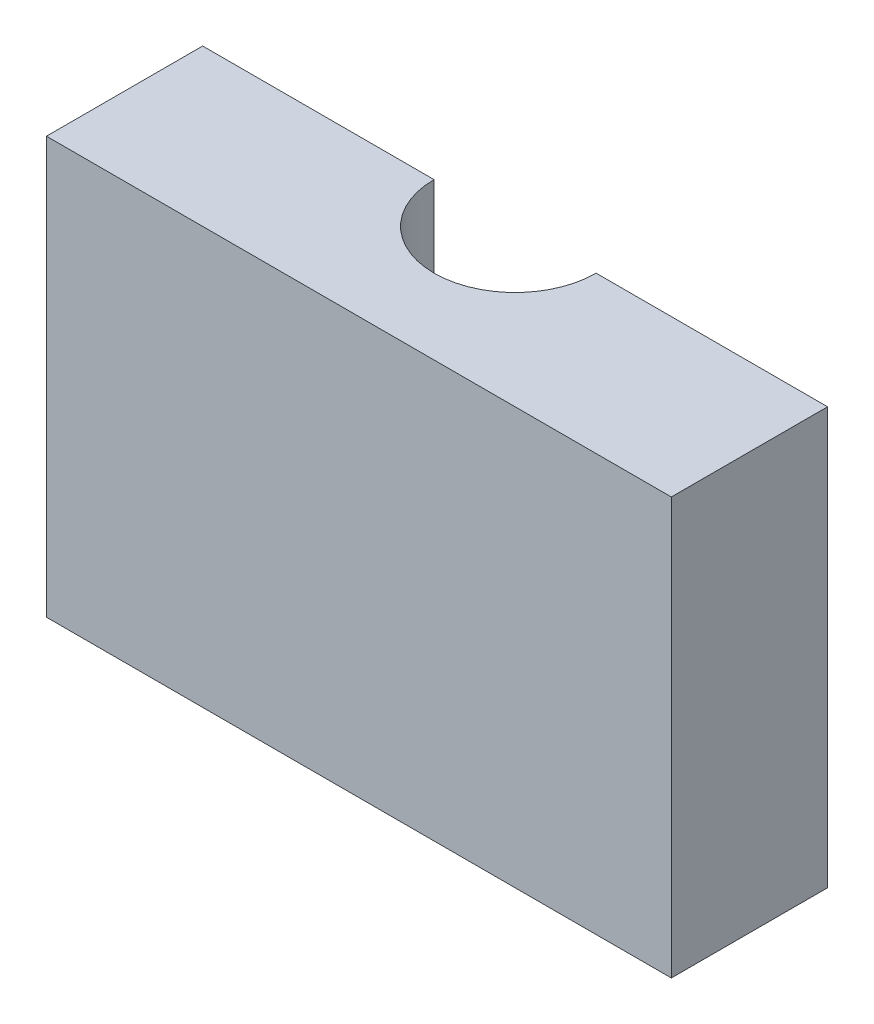
ISO-10303-21;
HEADER;
FILE_DESCRIPTION(('STEP AP214'),'2;1');
FILE_NAME('part.step','',(''),(''),'','','');
FILE_SCHEMA(('AUTOMOTIVE_DESIGN { 1 0 10303 214 1 1 1 1 }'));
ENDSEC;
DATA;
#1=APPLICATION_CONTEXT('core data for automotive mechanical design processes');
#2=APPLICATION_PROTOCOL_DEFINITION('international standard','automotive_design',2000,#1);
#3=PRODUCT_CONTEXT('',#1,'mechanical');
#4=PRODUCT('Part','Part','',(#3));
#5=PRODUCT_RELATED_PRODUCT_CATEGORY('part','',(#4));
#6=PRODUCT_DEFINITION_FORMATION('','',#4);
#7=PRODUCT_DEFINITION_CONTEXT('part definition',#1,'design');
#8=PRODUCT_DEFINITION('design','',#6,#7);
#9=PRODUCT_DEFINITION_SHAPE('','',#8);
#10=(LENGTH_UNIT() NAMED_UNIT(*) SI_UNIT(.MILLI.,.METRE.));
#11=(NAMED_UNIT(*) PLANE_ANGLE_UNIT() SI_UNIT($,.RADIAN.));
#12=(NAMED_UNIT(*) SI_UNIT($,.STERADIAN.) SOLID_ANGLE_UNIT());
#13=UNCERTAINTY_MEASURE_WITH_UNIT(LENGTH_MEASURE(1.E-05),#10,'distance_accuracy_value','');
#14=(GEOMETRIC_REPRESENTATION_CONTEXT(3) GLOBAL_UNCERTAINTY_ASSIGNED_CONTEXT((#13)) GLOBAL_UNIT_ASSIGNED_CONTEXT((#10,
#11,#12)) REPRESENTATION_CONTEXT('',''));
#15=CARTESIAN_POINT('',(0.,0.,0.));
#16=DIRECTION('',(0.,0.,1.));
#17=DIRECTION('',(1.,0.,0.));
#18=AXIS2_PLACEMENT_3D('',#15,#16,#17);
#19=CARTESIAN_POINT('',(38.1,-25.4,19.05));
#20=DIRECTION('',(-1.,0.,0.));
#21=DIRECTION('',(0.,0.,1.));
#22=AXIS2_PLACEMENT_3D('',#19,#20,#21);
#23=PLANE('',#22);
#24=DIRECTION('',(0.,0.,-1.));
#25=VECTOR('',#24,1.);
#26=CARTESIAN_POINT('',(38.1,-25.4,19.05));
#27=LINE('',#26,#25);
#28=CARTESIAN_POINT('',(38.1,-25.4,19.05));
#29=VERTEX_POINT('',#28);
#30=CARTESIAN_POINT('',(38.1,-25.4,0.));
#31=VERTEX_POINT('',#30);
#32=EDGE_CURVE('E236',#29,#31,#27,.T.);
#33=ORIENTED_EDGE('',*,*,#32,.T.);
#34=DIRECTION('',(0.,-1.,0.));
#35=VECTOR('',#34,1.);
#36=CARTESIAN_POINT('',(38.1,0.,0.));
#37=LINE('',#36,#35);
#38=CARTESIAN_POINT('',(38.1,25.4,0.));
#39=VERTEX_POINT('',#38);
#40=EDGE_CURVE('E112',#39,#31,#37,.T.);
#41=ORIENTED_EDGE('',*,*,#40,.F.);
#42=DIRECTION('',(0.,0.,-1.));
#43=VECTOR('',#42,1.);
#44=CARTESIAN_POINT('',(38.1,25.4,19.05));
#45=LINE('',#44,#43);
#46=CARTESIAN_POINT('',(38.1,25.4,19.05));
#47=VERTEX_POINT('',#46);
#48=EDGE_CURVE('E12',#47,#39,#45,.T.);
#49=ORIENTED_EDGE('',*,*,#48,.F.);
#50=DIRECTION('',(0.,1.,0.));
#51=VECTOR('',#50,1.);
#52=CARTESIAN_POINT('',(38.1,-25.4,19.05));
#53=LINE('',#52,#51);
#54=EDGE_CURVE('E183',#29,#47,#53,.T.);
#55=ORIENTED_EDGE('',*,*,#54,.F.);
#56=EDGE_LOOP('',(#33,#41,#49,#55));
#57=FACE_BOUND('',#56,.T.);
#58=ADVANCED_FACE('F45',(#57),#23,.F.);
#59=CARTESIAN_POINT('',(-38.1,25.4,19.05));
#60=DIRECTION('',(0.,-1.,0.));
#61=DIRECTION('',(0.,0.,-1.));
#62=AXIS2_PLACEMENT_3D('',#59,#60,#61);
#63=PLANE('',#62);
#64=ORIENTED_EDGE('',*,*,#48,.T.);
#65=DIRECTION('',(1.,0.,0.));
#66=VECTOR('',#65,1.);
#67=CARTESIAN_POINT('',(0.,25.4,0.));
#68=LINE('',#67,#66);
#69=CARTESIAN_POINT('',(9.8806,25.4,0.));
#70=VERTEX_POINT('',#69);
#71=EDGE_CURVE('E191',#70,#39,#68,.T.);
#72=ORIENTED_EDGE('',*,*,#71,.F.);
#73=CARTESIAN_POINT('',(0.,25.4,0.));
#74=DIRECTION('',(0.,-1.,0.));
#75=DIRECTION('',(0.,0.,-1.));
#76=AXIS2_PLACEMENT_3D('',#73,#74,#75);
#77=CIRCLE('',#76,9.8806);
#78=CARTESIAN_POINT('',(-9.8806,25.4,0.));
#79=VERTEX_POINT('',#78);
#80=EDGE_CURVE('E126',#79,#70,#77,.F.);
#81=ORIENTED_EDGE('',*,*,#80,.F.);
#82=CARTESIAN_POINT('',(-38.1,25.4,0.));
#83=VERTEX_POINT('',#82);
#84=EDGE_CURVE('E62',#83,#79,#68,.T.);
#85=ORIENTED_EDGE('',*,*,#84,.F.);
#86=DIRECTION('',(0.,0.,-1.));
#87=VECTOR('',#86,1.);
#88=CARTESIAN_POINT('',(-38.1,25.4,19.05));
#89=LINE('',#88,#87);
#90=CARTESIAN_POINT('',(-38.1,25.4,19.05));
#91=VERTEX_POINT('',#90);
#92=EDGE_CURVE('E54',#91,#83,#89,.T.);
#93=ORIENTED_EDGE('',*,*,#92,.F.);
#94=DIRECTION('',(-1.,0.,0.));
#95=VECTOR('',#94,1.);
#96=CARTESIAN_POINT('',(-38.1,25.4,19.05));
#97=LINE('',#96,#95);
#98=EDGE_CURVE('E185',#47,#91,#97,.T.);
#99=ORIENTED_EDGE('',*,*,#98,.F.);
#100=EDGE_LOOP('',(#64,#72,#81,#85,#93,#99));
#101=FACE_BOUND('',#100,.T.);
#102=ADVANCED_FACE('F188',(#101),#63,.F.);
#103=CARTESIAN_POINT('',(-38.1,-25.4,19.05));
#104=DIRECTION('',(1.,0.,0.));
#105=DIRECTION('',(0.,0.,-1.));
#106=AXIS2_PLACEMENT_3D('',#103,#104,#105);
#107=PLANE('',#106);
#108=ORIENTED_EDGE('',*,*,#92,.T.);
#109=DIRECTION('',(0.,1.,0.));
#110=VECTOR('',#109,1.);
#111=CARTESIAN_POINT('',(-38.1,0.,0.));
#112=LINE('',#111,#110);
#113=CARTESIAN_POINT('',(-38.1,-25.4,0.));
#114=VERTEX_POINT('',#113);
#115=EDGE_CURVE('E139',#114,#83,#112,.T.);
#116=ORIENTED_EDGE('',*,*,#115,.F.);
#117=DIRECTION('',(0.,0.,-1.));
#118=VECTOR('',#117,1.);
#119=CARTESIAN_POINT('',(-38.1,-25.4,19.05));
#120=LINE('',#119,#118);
#121=CARTESIAN_POINT('',(-38.1,-25.4,19.05));
#122=VERTEX_POINT('',#121);
#123=EDGE_CURVE('E238',#122,#114,#120,.T.);
#124=ORIENTED_EDGE('',*,*,#123,.F.);
#125=DIRECTION('',(0.,-1.,0.));
#126=VECTOR('',#125,1.);
#127=CARTESIAN_POINT('',(-38.1,-25.4,19.05));
#128=LINE('',#127,#126);
#129=EDGE_CURVE('E242',#91,#122,#128,.T.);
#130=ORIENTED_EDGE('',*,*,#129,.F.);
#131=EDGE_LOOP('',(#108,#116,#124,#130));
#132=FACE_BOUND('',#131,.T.);
#133=ADVANCED_FACE('F234',(#132),#107,.F.);
#134=CARTESIAN_POINT('',(-38.1,-25.4,19.05));
#135=DIRECTION('',(0.,1.,0.));
#136=DIRECTION('',(0.,0.,1.));
#137=AXIS2_PLACEMENT_3D('',#134,#135,#136);
#138=PLANE('',#137);
#139=CARTESIAN_POINT('',(0.,-25.4,0.));
#140=DIRECTION('',(0.,1.,0.));
#141=DIRECTION('',(-1.,0.,0.));
#142=AXIS2_PLACEMENT_3D('',#139,#140,#141);
#143=ELLIPSE('',#142,22.098,11.7221);
#144=CARTESIAN_POINT('',(-22.1019589881353,-25.4,-7.46369905566284E-06));
#145=VERTEX_POINT('',#144);
#146=CARTESIAN_POINT('',(22.1019274444906,-25.4,7.32040825631157E-06));
#147=VERTEX_POINT('',#146);
#148=EDGE_CURVE('E48',#145,#147,#143,.T.);
#149=ORIENTED_EDGE('',*,*,#148,.T.);
#150=DIRECTION('',(-1.,0.,0.));
#151=VECTOR('',#150,1.);
#152=CARTESIAN_POINT('',(0.,-25.4,0.));
#153=LINE('',#152,#151);
#154=EDGE_CURVE('E180',#31,#147,#153,.T.);
#155=ORIENTED_EDGE('',*,*,#154,.F.);
#156=ORIENTED_EDGE('',*,*,#32,.F.);
#157=DIRECTION('',(1.,0.,0.));
#158=VECTOR('',#157,1.);
#159=CARTESIAN_POINT('',(-38.1,-25.4,19.05));
#160=LINE('',#159,#158);
#161=EDGE_CURVE('E239',#122,#29,#160,.T.);
#162=ORIENTED_EDGE('',*,*,#161,.F.);
#163=ORIENTED_EDGE('',*,*,#123,.T.);
#164=EDGE_CURVE('E121',#145,#114,#153,.T.);
#165=ORIENTED_EDGE('',*,*,#164,.F.);
#166=EDGE_LOOP('',(#149,#155,#156,#162,#163,#165));
#167=FACE_BOUND('',#166,.T.);
#168=ADVANCED_FACE('F178',(#167),#138,.F.);
#169=CARTESIAN_POINT('',(0.,0.,19.05));
#170=DIRECTION('',(0.,0.,-1.));
#171=DIRECTION('',(-1.,0.,0.));
#172=AXIS2_PLACEMENT_3D('',#169,#170,#171);
#173=PLANE('',#172);
#174=ORIENTED_EDGE('',*,*,#54,.T.);
#175=ORIENTED_EDGE('',*,*,#98,.T.);
#176=ORIENTED_EDGE('',*,*,#129,.T.);
#177=ORIENTED_EDGE('',*,*,#161,.T.);
#178=EDGE_LOOP('',(#174,#175,#176,#177));
#179=FACE_BOUND('',#178,.T.);
#180=ADVANCED_FACE('F157',(#179),#173,.F.);
#181=CARTESIAN_POINT('',(9.77225838475019,12.7,1.4591855336727));
#182=CARTESIAN_POINT('',(14.1336856477358,8.73910093015792,1.4729798232886));
#183=CARTESIAN_POINT('',(25.087132150054,-1.20844455129475,1.50762330218542));
#184=CARTESIAN_POINT('',(23.075398835537,-16.3109737355857,1.62700901527332));
#185=CARTESIAN_POINT('',(21.8646945416059,-25.4,1.69885790022568));
#186=CARTESIAN_POINT('',(9.73199106483536,12.7,1.72885833784222));
#187=CARTESIAN_POINT('',(14.0823470325882,8.73910093015792,1.77282250676437));
#188=CARTESIAN_POINT('',(25.0079886827946,-1.20844455129475,1.88323571401753));
#189=CARTESIAN_POINT('',(22.9904900126863,-16.3109737355857,1.96794372238463));
#190=CARTESIAN_POINT('',(21.7763160039971,-25.4,2.01892282022048));
#191=CARTESIAN_POINT('',(9.6303199498135,12.7,2.25986148159423));
#192=CARTESIAN_POINT('',(13.9489701574063,8.73910093015792,2.36356692769036));
#193=CARTESIAN_POINT('',(24.7949848124144,-1.20844455129475,2.62401654368039));
#194=CARTESIAN_POINT('',(22.7705710304402,-16.3109737355857,2.63975404853283));
#195=CARTESIAN_POINT('',(21.5522353589856,-25.4,2.64922521678516));
#196=CARTESIAN_POINT('',(9.41730371199797,12.7,3.029192440976));
#197=CARTESIAN_POINT('',(13.6609354377259,8.73910093015792,3.22043564480291));
#198=CARTESIAN_POINT('',(24.3185459584344,-1.20844455129475,3.70073075824613));
#199=CARTESIAN_POINT('',(22.2971408365105,-16.3109737355857,3.61452250132493));
#200=CARTESIAN_POINT('',(21.0806158412602,-25.4,3.56264052170384));
#201=CARTESIAN_POINT('',(9.14667776919352,12.7,3.76920328162636));
#202=CARTESIAN_POINT('',(13.28906083889,8.73910093015792,4.0456313714392));
#203=CARTESIAN_POINT('',(23.6923918152202,-1.20844455129475,4.73986289495893));
#204=CARTESIAN_POINT('',(21.6869112110936,-16.3109737355857,4.55357414547988));
#205=CARTESIAN_POINT('',(20.4799699325003,-25.4,4.4414615770406));
#206=CARTESIAN_POINT('',(7.19466304419641,12.7,8.02046943822906));
#207=CARTESIAN_POINT('',(10.5795511374568,8.73910093015792,8.79221733120043));
#208=CARTESIAN_POINT('',(19.0804817755802,-1.20844455129475,10.7304129605715));
#209=CARTESIAN_POINT('',(17.2452506041065,-16.3109737355857,9.95696452534493));
#210=CARTESIAN_POINT('',(16.1407690887755,-25.4,9.49148665364798));
#211=CARTESIAN_POINT('',(2.8555793330397,12.7,10.4165355033875));
#212=CARTESIAN_POINT('',(4.38009341359381,8.73910093015792,11.5159060224529));
#213=CARTESIAN_POINT('',(8.20881332945667,-1.20844455129475,14.2769049892373));
#214=CARTESIAN_POINT('',(7.11164681713652,-16.3109737355857,13.0729855454805));
#215=CARTESIAN_POINT('',(6.45134845748915,-25.4,12.3484409800625));
#216=CARTESIAN_POINT('',(-6.8526416170632,12.7,8.96691198645358));
#217=CARTESIAN_POINT('',(-9.66097444454233,8.73910093015792,10.0525786096365));
#218=CARTESIAN_POINT('',(-16.7139232917138,-1.20844455129475,12.7791611156226));
#219=CARTESIAN_POINT('',(-15.8125393419943,-16.3109737355857,11.4566382912233));
#220=CARTESIAN_POINT('',(-15.2700671313236,-25.4,10.6607156653127));
#221=CARTESIAN_POINT('',(-10.5776047830468,12.7,3.9342705497178));
#222=CARTESIAN_POINT('',(-15.1604579506877,8.73910093015792,4.52387384622685));
#223=CARTESIAN_POINT('',(-26.6700014952407,-1.20844455129475,6.00462493445693));
#224=CARTESIAN_POINT('',(-24.7735752925523,-16.3109737355857,5.19168512695285));
#225=CARTESIAN_POINT('',(-23.6322652937815,-25.4,4.70244049967028));
#226=CARTESIAN_POINT('',(-8.96691198645358,12.7,-6.85264161706319));
#227=CARTESIAN_POINT('',(-13.1069133447839,8.73910093015792,-7.46983349280404));
#228=CARTESIAN_POINT('',(-23.5042628048672,-1.20844455129475,-9.01987153882777));
#229=CARTESIAN_POINT('',(-21.3772223785218,-16.3109737355857,-8.44570315749949));
#230=CARTESIAN_POINT('',(-20.0971237894302,-25.4,-8.10015630012164));
#231=CARTESIAN_POINT('',(-3.9342705497178,12.7,-10.5776047830468));
#232=CARTESIAN_POINT('',(-5.94021206449783,8.73910093015792,-11.6784979572102));
#233=CARTESIAN_POINT('',(-10.9780062873645,-1.20844455129475,-14.4433209751945));
#234=CARTESIAN_POINT('',(-9.6587786125955,-16.3109737355857,-13.2525796848424));
#235=CARTESIAN_POINT('',(-8.86483907846835,-25.4,-12.5359660150347));
#236=CARTESIAN_POINT('',(5.77395040038509,12.7,-9.1279812661129));
#237=CARTESIAN_POINT('',(8.10085579363831,8.73910093015792,-10.2151705443939));
#238=CARTESIAN_POINT('',(13.944730333806,-1.20844455129475,-12.9455771015797));
#239=CARTESIAN_POINT('',(13.2654075465353,-16.3109737355857,-11.6362324305852));
#240=CARTESIAN_POINT('',(12.8565765103444,-25.4,-10.8482407002849));
#241=CARTESIAN_POINT('',(9.22381288743033,12.7,-5.56887620142215));
#242=CARTESIAN_POINT('',(13.1666054310856,8.73910093015792,-6.31744816073156));
#243=CARTESIAN_POINT('',(23.0686775264259,-1.20844455129475,-8.19743891032351));
#244=CARTESIAN_POINT('',(21.5239740190549,-16.3109737355857,-7.22340926042368));
#245=CARTESIAN_POINT('',(20.5943382886481,-25.4,-6.63721730792168));
#246=CARTESIAN_POINT('',(9.84877959224607,12.7,-0.932817310645119));
#247=CARTESIAN_POINT('',(14.184201994655,8.73910093015792,-1.18243186054593));
#248=CARTESIAN_POINT('',(25.0723389476097,-1.20844455129475,-1.80932288810995));
#249=CARTESIAN_POINT('',(23.1673832028441,-16.3109737355857,-1.39097046069282));
#250=CARTESIAN_POINT('',(22.0209399425503,-25.4,-1.13919698923144));
#251=CARTESIAN_POINT('',(9.89142515370662,12.7,-0.146029028267609));
#252=CARTESIAN_POINT('',(14.2654141634167,8.73910093015792,-0.31001648551049));
#253=CARTESIAN_POINT('',(25.2504086917424,-1.20844455129475,-0.721860529134752));
#254=CARTESIAN_POINT('',(23.296886873469,-16.3109737355857,-0.399761419383619));
#255=CARTESIAN_POINT('',(22.1212155075853,-25.4,-0.205915260733738));
#256=CARTESIAN_POINT('',(9.87040879667328,12.7,0.651971194397396));
#257=CARTESIAN_POINT('',(14.2550702141331,8.73910093015792,0.575792517391809));
#258=CARTESIAN_POINT('',(25.2668678140884,-1.20844455129475,0.384474626966447));
#259=CARTESIAN_POINT('',(23.2768292420515,-16.3109737355857,0.606973598829173));
#260=CARTESIAN_POINT('',(22.079181309859,-25.4,0.740878256412555));
#261=CARTESIAN_POINT('',(9.81252570466502,12.7,1.18951272950317));
#262=CARTESIAN_POINT('',(14.1850242628834,8.73910093015792,1.17313713981283));
#263=CARTESIAN_POINT('',(25.1662756173133,-1.20844455129475,1.1320108903533));
#264=CARTESIAN_POINT('',(23.1603076583878,-16.3109737355857,1.28607430816201));
#265=CARTESIAN_POINT('',(21.9530730792146,-25.4,1.37879298023088));
#266=CARTESIAN_POINT('',(9.77225838475019,12.7,1.4591855336727));
#267=CARTESIAN_POINT('',(14.1336856477358,8.73910093015792,1.4729798232886));
#268=CARTESIAN_POINT('',(25.087132150054,-1.20844455129475,1.50762330218542));
#269=CARTESIAN_POINT('',(23.075398835537,-16.3109737355857,1.62700901527332));
#270=CARTESIAN_POINT('',(21.8646945416059,-25.4,1.69885790022568));
#271=B_SPLINE_SURFACE_WITH_KNOTS('',3,3,((#181,#182,#183,#184,#185),(#186,#187,#188,#189,#190),
(#191,#192,#193,#194,#195),(#196,#197,#198,#199,#200),(#201,#202,#203,#204,#205),(#206,#207,
#208,#209,#210),(#211,#212,#213,#214,#215),(#216,#217,#218,#219,#220),(#221,#222,#223,#224,
#225),(#226,#227,#228,#229,#230),(#231,#232,#233,#234,#235),(#236,#237,#238,#239,#240),(#241,
#242,#243,#244,#245),(#246,#247,#248,#249,#250),(#251,#252,#253,#254,#255),(#256,#257,#258,#259,
#260),(#261,#262,#263,#264,#265),(#266,#267,#268,#269,#270)),.UNSPECIFIED.,.T.,.F.,.F.,(4,1,1,1,
1,2,2,2,1,1,1,1,4),(4,1,4),(0.,0.0125,0.0249999999999999,0.0375000000000001,0.05,0.25,0.5,0.75,
0.95,0.9625,0.975,0.9875,1.),(0.,0.398178533310275,1.),.UNSPECIFIED.);
#272=CARTESIAN_POINT('',(-9.88172679733598,12.7,-8.19736424387044E-06));
#273=CARTESIAN_POINT('',(-9.88189672015932,12.7,0.164818626537073));
#274=CARTESIAN_POINT('',(-9.87791862704196,12.7,0.329650183013946));
#275=CARTESIAN_POINT('',(-9.86173571738352,12.7,0.657681454126317));
#276=CARTESIAN_POINT('',(-9.84959221870248,12.7,0.820884196430956));
#277=CARTESIAN_POINT('',(-9.81725498491208,12.7,1.14541959489437));
#278=CARTESIAN_POINT('',(-9.7971140584227,12.7,1.30675751224433));
#279=CARTESIAN_POINT('',(-9.74896702130205,12.7,1.62732546048826));
#280=CARTESIAN_POINT('',(-9.72100587618124,12.7,1.78656224652566));
#281=CARTESIAN_POINT('',(-9.65740021826624,12.7,2.10269095908212));
#282=CARTESIAN_POINT('',(-9.62179358300551,12.7,2.25959050803901));
#283=CARTESIAN_POINT('',(-9.54307864555011,12.7,2.57080834609488));
#284=CARTESIAN_POINT('',(-9.50000185367354,12.7,2.7251346065516));
#285=CARTESIAN_POINT('',(-9.40652738382769,12.7,3.03096996689708));
#286=CARTESIAN_POINT('',(-9.35615553818489,12.7,3.18248696349762));
#287=CARTESIAN_POINT('',(-9.24827108423939,12.7,3.48246829061058));
#288=CARTESIAN_POINT('',(-9.19077926759534,12.7,3.6309400997575));
#289=CARTESIAN_POINT('',(-9.06883433547866,12.7,3.92459586525477));
#290=CARTESIAN_POINT('',(-9.00439754700236,12.7,4.06978660253197));
#291=CARTESIAN_POINT('',(-8.86874155668963,12.7,4.35664529388166));
#292=CARTESIAN_POINT('',(-8.79753472515876,12.7,4.49831909851572));
#293=CARTESIAN_POINT('',(-8.64851702260477,12.7,4.77790920615785));
#294=CARTESIAN_POINT('',(-8.57071500238451,12.7,4.91583022689792));
#295=CARTESIAN_POINT('',(-8.40868485850965,12.7,5.18768023282691));
#296=CARTESIAN_POINT('',(-8.32446243286154,12.7,5.32161261436565));
#297=CARTESIAN_POINT('',(-8.14976904756581,12.7,5.58525098140914));
#298=CARTESIAN_POINT('',(-8.05930093231365,12.7,5.71495885173259));
#299=CARTESIAN_POINT('',(-7.87229343849935,12.7,5.96991401370263));
#300=CARTESIAN_POINT('',(-7.77575428758895,12.7,6.09516147233025));
#301=CARTESIAN_POINT('',(-7.57678175639444,12.7,6.34096182492867));
#302=CARTESIAN_POINT('',(-7.47434616871707,12.7,6.46151293207833));
#303=CARTESIAN_POINT('',(-7.26375761558237,12.7,6.69768682450895));
#304=CARTESIAN_POINT('',(-7.15560014311328,12.7,6.81330559120772));
#305=CARTESIAN_POINT('',(-6.93374453479323,12.7,7.03938131845045));
#306=CARTESIAN_POINT('',(-6.82003969199904,12.7,7.1498316976614));
#307=CARTESIAN_POINT('',(-6.58726595456328,12.7,7.3653374934144));
#308=CARTESIAN_POINT('',(-6.46818822911489,12.7,7.47038337231977));
#309=CARTESIAN_POINT('',(-6.22484525702681,12.7,7.67484740266276));
#310=CARTESIAN_POINT('',(-6.10056912185166,12.7,7.77425259631648));
#311=CARTESIAN_POINT('',(-5.84700578820758,12.7,7.96720295425707));
#312=CARTESIAN_POINT('',(-5.71770571488862,12.7,8.06073120096675));
#313=CARTESIAN_POINT('',(-5.45427088287096,12.7,8.24169590195745));
#314=CARTESIAN_POINT('',(-5.32012135632962,12.7,8.32911086064361));
#315=CARTESIAN_POINT('',(-5.04716389186379,12.7,8.49761783977952));
#316=CARTESIAN_POINT('',(-4.90833942614656,12.7,8.57868309038838));
#317=CARTESIAN_POINT('',(-4.62620821167104,12.7,8.73426019997487));
#318=CARTESIAN_POINT('',(-4.48288336652116,12.7,8.80873924520733));
#319=CARTESIAN_POINT('',(-4.19192731561803,12.7,8.95091425921192));
#320=CARTESIAN_POINT('',(-4.04427671326992,12.7,9.01857053651363));
#321=CARTESIAN_POINT('',(-3.74484478592264,12.7,9.14687113911879));
#322=CARTESIAN_POINT('',(-3.59304312757769,12.7,9.20746801152747));
#323=CARTESIAN_POINT('',(-3.28548434506722,12.7,9.32142185716532));
#324=CARTESIAN_POINT('',(-3.12970642548521,12.7,9.37472270305863));
#325=CARTESIAN_POINT('',(-2.81436988607316,12.7,9.47385721999038));
#326=CARTESIAN_POINT('',(-2.65479060770308,12.7,9.51962516971486));
#327=CARTESIAN_POINT('',(-2.33202549552964,12.7,9.60346834545155));
#328=CARTESIAN_POINT('',(-2.16881987166267,12.7,9.64146737204265));
#329=CARTESIAN_POINT('',(-1.8389754837353,12.7,9.70954484077519));
#330=CARTESIAN_POINT('',(-1.6723186650728,12.7,9.73953574266796));
#331=CARTESIAN_POINT('',(-1.3373826285795,12.7,9.79112952798857));
#332=CARTESIAN_POINT('',(-1.16910090122854,12.7,9.81271611890582));
#333=CARTESIAN_POINT('',(-0.83343091724891,12.7,9.84710760153113));
#334=CARTESIAN_POINT('',(-0.666051896808983,12.7,9.86000252449669));
#335=CARTESIAN_POINT('',(-0.332445268143639,12.7,9.87718948154195));
#336=CARTESIAN_POINT('',(-0.166221812657699,12.7,9.88156201828668));
#337=CARTESIAN_POINT('',(0.164833030197427,12.7,9.88189021586994));
#338=CARTESIAN_POINT('',(0.329664344906685,12.7,9.87791649148423));
#339=CARTESIAN_POINT('',(0.65769537882489,12.7,9.86173645692129));
#340=CARTESIAN_POINT('',(0.820898123909287,12.7,9.84959150767346));
#341=CARTESIAN_POINT('',(1.1454334541076,12.7,9.81725293152923));
#342=CARTESIAN_POINT('',(1.30677130089855,12.7,9.79711210297808));
#343=CARTESIAN_POINT('',(1.62733911902386,12.7,9.74896485502147));
#344=CARTESIAN_POINT('',(1.78657584543506,12.7,9.72100340322478));
#345=CARTESIAN_POINT('',(2.10270442726547,12.7,9.65739724652296));
#346=CARTESIAN_POINT('',(2.25960390516215,12.7,9.62179041843157));
#347=CARTESIAN_POINT('',(2.57082159561295,12.7,9.54307507140975));
#348=CARTESIAN_POINT('',(2.72514777952314,12.7,9.49999806274516));
#349=CARTESIAN_POINT('',(3.03098297971513,12.7,9.4065231722121));
#350=CARTESIAN_POINT('',(3.18249989270248,12.7,9.35615112249074));
#351=CARTESIAN_POINT('',(3.48248104596159,12.7,9.24826626345723));
#352=CARTESIAN_POINT('',(3.63095276485142,12.7,9.19077424567428));
#353=CARTESIAN_POINT('',(3.92460834310246,12.7,9.06882891694299));
#354=CARTESIAN_POINT('',(4.06979898336717,12.7,9.00439193286986));
#355=CARTESIAN_POINT('',(4.35665747399652,12.7,8.86873555631445));
#356=CARTESIAN_POINT('',(4.49833117489316,12.7,8.79752853403164));
#357=CARTESIAN_POINT('',(4.77792106836263,12.7,8.64851045509717));
#358=CARTESIAN_POINT('',(4.91584197863242,12.7,8.57070824915342));
#359=CARTESIAN_POINT('',(5.1876917569302,12.7,8.40867773889383));
#360=CARTESIAN_POINT('',(5.32162402126763,12.7,8.32445513249908));
#361=CARTESIAN_POINT('',(5.58526214722224,12.7,8.14976139077614));
#362=CARTESIAN_POINT('',(5.71496989361213,12.7,8.05929309976564));
#363=CARTESIAN_POINT('',(5.96992480103422,12.7,7.87228525948944));
#364=CARTESIAN_POINT('',(6.09517212899523,12.7,7.77574593780362));
#365=CARTESIAN_POINT('',(6.34097221358551,12.7,7.57677307010859));
#366=CARTESIAN_POINT('',(6.46152318333413,12.7,7.47433731663874));
#367=CARTESIAN_POINT('',(6.69769679429512,12.7,7.26374843696274));
#368=CARTESIAN_POINT('',(6.81331541685716,12.7,7.15559080368076));
#369=CARTESIAN_POINT('',(7.03939084916643,12.7,6.93373487878226));
#370=CARTESIAN_POINT('',(7.14984107750222,12.7,6.8200298801609));
#371=CARTESIAN_POINT('',(7.36534656485871,12.7,6.58725583608948));
#372=CARTESIAN_POINT('',(7.4703922861521,12.7,6.4681779597729));
#373=CARTESIAN_POINT('',(7.67485599462372,12.7,6.22483469106258));
#374=CARTESIAN_POINT('',(7.7742610239131,12.7,6.10055841007578));
#375=CARTESIAN_POINT('',(7.96721104654195,12.7,5.84699478955505));
#376=CARTESIAN_POINT('',(8.0607391221829,12.7,5.71769457511478));
#377=CARTESIAN_POINT('',(8.24170347428195,12.7,5.45425946696791));
#378=CARTESIAN_POINT('',(8.32911825500448,12.7,5.32010980536993));
#379=CARTESIAN_POINT('',(8.49762487218136,12.7,5.04715207176466));
#380=CARTESIAN_POINT('',(8.57868993863586,12.7,4.90832747190053));
#381=CARTESIAN_POINT('',(8.73426667126074,12.7,4.62619600938413));
#382=CARTESIAN_POINT('',(8.80874552349196,12.7,4.48287105037101));
#383=CARTESIAN_POINT('',(8.9509201527941,12.7,4.1919147195054));
#384=CARTESIAN_POINT('',(9.01857623822924,12.7,4.04426395070937));
#385=CARTESIAN_POINT('',(9.14687642105731,12.7,3.74483191097723));
#386=CARTESIAN_POINT('',(9.20747306513254,12.7,3.59303030805056));
#387=CARTESIAN_POINT('',(9.32142655888543,12.7,3.28547082915088));
#388=CARTESIAN_POINT('',(9.37472728178073,12.7,3.12969215181304));
#389=CARTESIAN_POINT('',(9.4738611262609,12.7,2.8143571674149));
#390=CARTESIAN_POINT('',(9.51962852274947,12.7,2.6547802273434));
#391=CARTESIAN_POINT('',(9.60347217312437,12.7,2.33200820894106));
#392=CARTESIAN_POINT('',(9.64147224220167,12.7,2.16879323165413));
#393=CARTESIAN_POINT('',(9.68462405734521,12.7,1.95972082861558));
#394=CARTESIAN_POINT('',(9.69360523399736,12.7,1.91463239809046));
#395=CARTESIAN_POINT('',(9.71097009686242,12.7,1.82420233964608));
#396=CARTESIAN_POINT('',(9.71935194653138,12.7,1.77886035709543));
#397=CARTESIAN_POINT('',(9.74363107923558,12.7,1.64225096339833));
#398=CARTESIAN_POINT('',(9.75857666292193,12.7,1.55081324736814));
#399=CARTESIAN_POINT('',(9.79048680062489,12.7,1.33710820365137));
#400=CARTESIAN_POINT('',(9.80647176878913,12.7,1.2146936138066));
#401=CARTESIAN_POINT('',(9.83379022582391,12.7,0.970325027928238));
#402=CARTESIAN_POINT('',(9.8451594120976,12.7,0.848375015810071));
#403=CARTESIAN_POINT('',(9.86331620821015,12.7,0.605026567425664));
#404=CARTESIAN_POINT('',(9.87013656955124,12.7,0.483630578891101));
#405=CARTESIAN_POINT('',(9.87926812659709,12.7,0.241483225536023));
#406=CARTESIAN_POINT('',(9.88160920440965,12.7,0.120732986062741));
#407=CARTESIAN_POINT('',(9.88172682543823,12.7,-2.01422347354251E-05));
#408=B_SPLINE_CURVE_WITH_KNOTS('',3,(#272,#273,#274,#275,#276,#277,#278,#279,#280,#281,#282,
#283,#284,#285,#286,#287,#288,#289,#290,#291,#292,#293,#294,#295,#296,#297,#298,#299,#300,#301,
#302,#303,#304,#305,#306,#307,#308,#309,#310,#311,#312,#313,#314,#315,#316,#317,#318,#319,#320,
#321,#322,#323,#324,#325,#326,#327,#328,#329,#330,#331,#332,#333,#334,#335,#336,#337,#338,#339,
#340,#341,#342,#343,#344,#345,#346,#347,#348,#349,#350,#351,#352,#353,#354,#355,#356,#357,#358,
#359,#360,#361,#362,#363,#364,#365,#366,#367,#368,#369,#370,#371,#372,#373,#374,#375,#376,#377,
#378,#379,#380,#381,#382,#383,#384,#385,#386,#387,#388,#389,#390,#391,#392,#393,#394,#395,#396,
#397,#398,#399,#400,#401,#402,#403,#404,#405,#406,#407),.UNSPECIFIED.,.F.,.F.,(4,2,2,2,2,2,2,2,
2,2,2,2,2,2,2,2,2,2,2,2,2,2,2,2,2,2,2,2,2,2,2,2,2,2,2,2,2,2,2,2,2,2,2,2,2,2,2,2,2,2,2,2,2,2,2,2,
2,2,2,2,2,2,2,2,2,2,2,4),(0.,0.494429287991037,0.985186536049581,1.47275571425862,
1.95757709921612,2.44004981368581,2.92053479942982,3.39935816717145,3.8768148681187,
4.3531726338477,4.82867613498341,5.30355131342605,5.77800984731805,6.25225371207167,
6.72647980421639,7.20088459730642,7.67566880047273,8.15104199031679,8.62722718571885,
9.10446533284758,9.5830196643753,10.063179892878,10.5452661939799,11.0296329304285,
11.5166720644839,12.0068162033599,12.5005412215853,12.9983684056558,13.5008660707202,
14.0086506066483,14.5174146843603,15.0208243169941,15.5194552329681,16.0138844088222,
16.5046415592006,16.9922106529074,17.4770319653278,17.9595046180913,18.4399895519166,
18.9188128765839,19.396269542467,19.8726272804235,20.3481307604814,20.8230059240695,
21.297464448988,21.7717083104379,22.24593440487,22.7203392058932,23.1951234228254,
23.670496632587,24.1466818545062,24.6239200353264,25.1024744084166,25.5826346871665,
26.0647210481242,26.5490878550633,27.0361270713623,27.5262713054344,28.0199964330765,
28.5178237421059,29.0203215490314,29.1582418251756,29.2965680730885,29.5744856606061,
29.9447605008459,30.3121145182146,30.6767941838238,31.0390324054906),.UNSPECIFIED.);
#409=CARTESIAN_POINT('',(9.88116341270768,12.7,-2.07001184650048E-05));
#410=VERTEX_POINT('',#409);
#411=CARTESIAN_POINT('',(-9.88116340176562,12.7,-1.11817730899691E-06));
#412=VERTEX_POINT('',#411);
#413=EDGE_CURVE('E118',#410,#412,#408,.F.);
#414=CARTESIAN_POINT('',(22.1004588175771,-25.4,7.23850639801002E-13));
#415=CARTESIAN_POINT('',(22.1662759105087,-24.8927848426811,2.60085997615544E-13));
#416=CARTESIAN_POINT('',(22.2321200269299,-24.385568953275,0.));
#417=CARTESIAN_POINT('',(22.3623901431484,-23.3703769561709,0.));
#418=CARTESIAN_POINT('',(22.4268144676026,-22.8624006343544,0.));
#419=CARTESIAN_POINT('',(22.552658581547,-21.8457400423585,0.));
#420=CARTESIAN_POINT('',(22.6140764099069,-21.3370555269454,0.));
#421=CARTESIAN_POINT('',(22.7322591791266,-20.3190267520731,0.));
#422=CARTESIAN_POINT('',(22.7890230811743,-19.8096823709572,0.));
#423=CARTESIAN_POINT('',(22.8981927233643,-18.7711945916502,0.));
#424=CARTESIAN_POINT('',(22.9503550658299,-18.2420253000457,0.));
#425=CARTESIAN_POINT('',(23.0457808193285,-17.183027603297,0.));
#426=CARTESIAN_POINT('',(23.0890468083784,-16.6531994339854,0.));
#427=CARTESIAN_POINT('',(23.164489940578,-15.5928934103017,0.));
#428=CARTESIAN_POINT('',(23.1966702763482,-15.062415787211,0.));
#429=CARTESIAN_POINT('',(23.2475601114391,-14.000795369967,0.));
#430=CARTESIAN_POINT('',(23.2662698071004,-13.4696525856217,0.));
#431=CARTESIAN_POINT('',(23.285025293931,-12.5342928261733,0.));
#432=CARTESIAN_POINT('',(23.2884680107202,-12.1301450918061,0.));
#433=CARTESIAN_POINT('',(23.2847720579238,-11.3218468757773,0.));
#434=CARTESIAN_POINT('',(23.2776323924588,-10.9176963974368,0.));
#435=CARTESIAN_POINT('',(23.2514225745935,-10.1097595597073,0.));
#436=CARTESIAN_POINT('',(23.2323521361705,-9.7059732092802,0.));
#437=CARTESIAN_POINT('',(23.180842082836,-8.89913044297491,0.));
#438=CARTESIAN_POINT('',(23.1483989581254,-8.49607424664811,0.));
#439=CARTESIAN_POINT('',(23.0692841441595,-7.69790587192157,0.));
#440=CARTESIAN_POINT('',(23.0228503360333,-7.30277040038677,0.));
#441=CARTESIAN_POINT('',(22.9141110871187,-6.51464823502059,0.));
#442=CARTESIAN_POINT('',(22.851804905327,-6.12166164238501,0.));
#443=CARTESIAN_POINT('',(22.7098656934211,-5.33891317182155,0.));
#444=CARTESIAN_POINT('',(22.6302371573971,-4.94915048466169,0.));
#445=CARTESIAN_POINT('',(22.4522210132689,-4.17390918944622,0.));
#446=CARTESIAN_POINT('',(22.3538339499144,-3.78843045732799,0.));
#447=CARTESIAN_POINT('',(22.1566772125551,-3.09254449640839,0.));
#448=CARTESIAN_POINT('',(22.0612124571912,-2.78120024028797,0.));
#449=CARTESIAN_POINT('',(21.8562439446828,-2.16314552827177,0.));
#450=CARTESIAN_POINT('',(21.7467398178641,-1.85643519463076,0.));
#451=CARTESIAN_POINT('',(21.5132476018454,-1.24866738129835,0.));
#452=CARTESIAN_POINT('',(21.3892643181544,-0.947608064370391,0.));
#453=CARTESIAN_POINT('',(21.1922309972549,-0.500990738423181,0.));
#454=CARTESIAN_POINT('',(21.1247213201023,-0.352969147860945,0.));
#455=CARTESIAN_POINT('',(20.9859695744178,-0.0586858232820205,0.));
#456=CARTESIAN_POINT('',(20.9147275194754,0.0875759171398952,0.));
#457=CARTESIAN_POINT('',(20.6936634242476,0.527366641439175,0.));
#458=CARTESIAN_POINT('',(20.5381917397535,0.818073935972209,0.));
#459=CARTESIAN_POINT('',(20.2138458016279,1.39201501106897,0.));
#460=CARTESIAN_POINT('',(20.0449664432771,1.67524588991179,0.));
#461=CARTESIAN_POINT('',(19.6952500507413,2.23435370331465,0.));
#462=CARTESIAN_POINT('',(19.5144087053192,2.51022793563626,0.));
#463=CARTESIAN_POINT('',(19.1422623517539,3.05473274571886,0.));
#464=CARTESIAN_POINT('',(18.9509590863697,3.32336451887345,0.));
#465=CARTESIAN_POINT('',(18.4991700673828,3.93503067552515,0.));
#466=CARTESIAN_POINT('',(18.2354350441556,4.27566418777598,0.));
#467=CARTESIAN_POINT('',(17.694940500299,4.94627436447998,0.));
#468=CARTESIAN_POINT('',(17.4181834074081,5.27625299615886,0.));
#469=CARTESIAN_POINT('',(16.8536812601919,5.92701169200513,0.));
#470=CARTESIAN_POINT('',(16.5659292961923,6.24778574230886,0.));
#471=CARTESIAN_POINT('',(15.9813204500555,6.88143310790821,0.));
#472=CARTESIAN_POINT('',(15.684455594486,7.19429904078214,0.));
#473=CARTESIAN_POINT('',(15.0833717100597,7.81331400204969,0.));
#474=CARTESIAN_POINT('',(14.7791473930866,8.119457879687,0.));
#475=CARTESIAN_POINT('',(14.1736918152509,8.71752361306551,0.));
#476=CARTESIAN_POINT('',(13.8726161688181,9.00960347865095,0.));
#477=CARTESIAN_POINT('',(13.2665175482504,9.58937495922014,0.));
#478=CARTESIAN_POINT('',(12.9614962585041,9.87706833948694,0.));
#479=CARTESIAN_POINT('',(12.3489076665623,10.448919607109,0.));
#480=CARTESIAN_POINT('',(12.0413441992674,10.7330816124117,0.));
#481=CARTESIAN_POINT('',(11.4250307118323,11.2986761932144,0.));
#482=CARTESIAN_POINT('',(11.116285074412,11.5801135577026,0.));
#483=CARTESIAN_POINT('',(10.49892487626,12.1410246554287,0.));
#484=CARTESIAN_POINT('',(10.1903134287772,12.4205018113309,0.));
#485=CARTESIAN_POINT('',(9.88172680547307,12.7,0.));
#486=B_SPLINE_CURVE_WITH_KNOTS('',3,(#414,#415,#416,#417,#418,#419,#420,#421,#422,#423,#424,
#425,#426,#427,#428,#429,#430,#431,#432,#433,#434,#435,#436,#437,#438,#439,#440,#441,#442,#443,
#444,#445,#446,#447,#448,#449,#450,#451,#452,#453,#454,#455,#456,#457,#458,#459,#460,#461,#462,
#463,#464,#465,#466,#467,#468,#469,#470,#471,#472,#473,#474,#475,#476,#477,#478,#479,#480,#481,
#482,#483,#484,#485),.UNSPECIFIED.,.F.,.F.,(4,2,2,2,2,2,2,2,2,2,2,2,2,2,2,2,2,2,2,2,2,2,2,2,2,2,
2,2,2,2,2,2,2,2,2,4),(0.,1.53440991864325,3.07054274471551,4.60766458688766,6.14512860419795,
7.74027292557319,9.33495434690654,10.9291761221639,12.5233746604605,13.7357440288511,
14.9482274972805,16.1607400343159,17.3735710105696,18.5668443086869,19.7601733250956,
20.9531931141276,22.1461782629965,23.1228223053257,24.0994920691978,25.0758386010102,
25.563862715444,26.0518850531066,27.0404639248694,28.029421001209,29.018736471833,
30.0078876401581,31.2998779716046,32.5916283809791,33.884204385607,35.1779455278789,
36.4726456460775,37.7310105549368,38.9888549229756,40.2450604784421,41.4983639131989,
42.747412609627),.UNSPECIFIED.);
#487=EDGE_CURVE('E70',#147,#410,#486,.T.);
#488=CARTESIAN_POINT('',(-9.88172680545381,12.7,-9.70814056856957E-09));
#489=CARTESIAN_POINT('',(-10.1465933515126,12.4601027241142,-3.49234404019179E-09));
#490=CARTESIAN_POINT('',(-10.4114760546887,12.2202203554792,-9.37383055662508E-10));
#491=CARTESIAN_POINT('',(-10.9416008886766,11.7389797343626,9.40684168642178E-10));
#492=CARTESIAN_POINT('',(-11.2068410002221,11.4976192593553,2.52377336956557E-10));
#493=CARTESIAN_POINT('',(-11.7368275399723,11.0129625568146,-2.53039015656306E-10));
#494=CARTESIAN_POINT('',(-12.0015708506526,10.7696629132087,-6.78597147326744E-11));
#495=CARTESIAN_POINT('',(-12.5296864390919,10.2806442259311,6.79796547846522E-11));
#496=CARTESIAN_POINT('',(-12.793055466545,10.0349216660975,1.82246390343843E-11));
#497=CARTESIAN_POINT('',(-13.3175219767635,9.54054760407482,-1.82424807986519E-11));
#498=CARTESIAN_POINT('',(-13.578616983287,9.29189346998287,-4.89281872878909E-12));
#499=CARTESIAN_POINT('',(-14.0976069952452,8.79111691198116,4.89419006884698E-12));
#500=CARTESIAN_POINT('',(-14.3555010832859,8.53899353552566,1.3267956304787E-12));
#501=CARTESIAN_POINT('',(-14.8737839129311,8.02409391719795,-1.36090365679178E-12));
#502=CARTESIAN_POINT('',(-15.1340663545871,7.76121043796823,-3.64529343811672E-13));
#503=CARTESIAN_POINT('',(-15.6491984737874,7.23050149339569,3.642867851835E-13));
#504=CARTESIAN_POINT('',(-15.9040516510623,6.96267943285564,0.));
#505=CARTESIAN_POINT('',(-16.4072047521804,6.42137091632147,0.));
#506=CARTESIAN_POINT('',(-16.6555102135185,6.14788962023867,0.));
#507=CARTESIAN_POINT('',(-17.1443850404908,5.59448486497977,0.));
#508=CARTESIAN_POINT('',(-17.3849606674525,5.31456695196006,0.));
#509=CARTESIAN_POINT('',(-17.8571195553045,4.7474469438531,0.));
#510=CARTESIAN_POINT('',(-18.0887069455094,4.46024829633497,0.));
#511=CARTESIAN_POINT('',(-18.5415495533399,3.87764647796922,0.));
#512=CARTESIAN_POINT('',(-18.762801520489,3.58224077197743,0.));
#513=CARTESIAN_POINT('',(-19.1784007508254,3.00329236511582,0.));
#514=CARTESIAN_POINT('',(-19.3735521881284,2.72032839201165,0.));
#515=CARTESIAN_POINT('',(-19.7518596026585,2.14639265757871,0.));
#516=CARTESIAN_POINT('',(-19.9350132323582,1.85541934484185,0.));
#517=CARTESIAN_POINT('',(-20.2875844501974,1.26538212170251,0.));
#518=CARTESIAN_POINT('',(-20.4570076505137,0.966321584217027,0.));
#519=CARTESIAN_POINT('',(-20.699585636723,0.511663721700708,0.));
#520=CARTESIAN_POINT('',(-20.7785068408262,0.359125423130608,0.));
#521=CARTESIAN_POINT('',(-20.9322776900265,0.0520109027879274,0.));
#522=CARTESIAN_POINT('',(-21.0071273623776,-0.102565305334609,0.));
#523=CARTESIAN_POINT('',(-21.2236054573542,-0.565275971098447,0.));
#524=CARTESIAN_POINT('',(-21.3592216378001,-0.876246304841602,0.));
#525=CARTESIAN_POINT('',(-21.6146201464474,-1.50477566730709,0.));
#526=CARTESIAN_POINT('',(-21.7343942752401,-1.82233801026429,0.));
#527=CARTESIAN_POINT('',(-21.9585416343308,-2.46299997962654,0.));
#528=CARTESIAN_POINT('',(-22.0629081299645,-2.78610195893731,0.));
#529=CARTESIAN_POINT('',(-22.2568170182,-3.43669984087004,0.));
#530=CARTESIAN_POINT('',(-22.3463594673324,-3.76419572673099,0.));
#531=CARTESIAN_POINT('',(-22.5387238822107,-4.53178255905809,0.));
#532=CARTESIAN_POINT('',(-22.6361201252677,-4.97323703281803,0.));
#533=CARTESIAN_POINT('',(-22.8080231541618,-5.86053051302346,0.));
#534=CARTESIAN_POINT('',(-22.8825295183275,-6.30636960008503,0.));
#535=CARTESIAN_POINT('',(-23.0108357874431,-7.20114296893147,0.));
#536=CARTESIAN_POINT('',(-23.0646285231967,-7.65007826772142,0.));
#537=CARTESIAN_POINT('',(-23.1536318715102,-8.54973790030621,0.));
#538=CARTESIAN_POINT('',(-23.1888431829888,-9.00046216616854,0.));
#539=CARTESIAN_POINT('',(-23.2432265517504,-9.91030250179627,0.));
#540=CARTESIAN_POINT('',(-23.2621249205613,-10.3694345317711,0.));
#541=CARTESIAN_POINT('',(-23.2849673192965,-11.2878927940589,0.));
#542=CARTESIAN_POINT('',(-23.2889163961866,-11.7472189084623,0.));
#543=CARTESIAN_POINT('',(-23.2838101556138,-12.6657695272273,0.));
#544=CARTESIAN_POINT('',(-23.274755175343,-13.1249940339149,0.));
#545=CARTESIAN_POINT('',(-23.2454313943253,-14.0430432259914,0.));
#546=CARTESIAN_POINT('',(-23.2251632733092,-14.5018679339274,0.));
#547=CARTESIAN_POINT('',(-23.1758904174235,-15.4038144095276,0.));
#548=CARTESIAN_POINT('',(-23.1471968631564,-15.8469535531246,0.));
#549=CARTESIAN_POINT('',(-23.0822457293939,-16.7326337042592,0.));
#550=CARTESIAN_POINT('',(-23.0459887657498,-17.1751747575454,0.));
#551=CARTESIAN_POINT('',(-22.9671852188014,-18.0597222775025,0.));
#552=CARTESIAN_POINT('',(-22.924638188443,-18.5017287039228,0.));
#553=CARTESIAN_POINT('',(-22.8344471375918,-19.3852634198128,0.));
#554=CARTESIAN_POINT('',(-22.7868025855749,-19.8267916545628,0.));
#555=CARTESIAN_POINT('',(-22.6890027415051,-20.6964573236845,0.));
#556=CARTESIAN_POINT('',(-22.6389620509295,-21.1246077442859,0.));
#557=CARTESIAN_POINT('',(-22.5361293483501,-21.980546462056,0.));
#558=CARTESIAN_POINT('',(-22.483337524318,-22.4083347819411,0.));
#559=CARTESIAN_POINT('',(-22.37595935889,-23.2635834766702,0.));
#560=CARTESIAN_POINT('',(-22.3213734377076,-23.6910439046463,0.));
#561=CARTESIAN_POINT('',(-22.2113388001523,-24.5456693936717,0.));
#562=CARTESIAN_POINT('',(-22.1558904602123,-24.9728345030504,0.));
#563=CARTESIAN_POINT('',(-22.1004588175771,-25.4,0.));
#564=B_SPLINE_CURVE_WITH_KNOTS('',3,(#488,#489,#490,#491,#492,#493,#494,#495,#496,#497,#498,
#499,#500,#501,#502,#503,#504,#505,#506,#507,#508,#509,#510,#511,#512,#513,#514,#515,#516,#517,
#518,#519,#520,#521,#522,#523,#524,#525,#526,#527,#528,#529,#530,#531,#532,#533,#534,#535,#536,
#537,#538,#539,#540,#541,#542,#543,#544,#545,#546,#547,#548,#549,#550,#551,#552,#553,#554,#555,
#556,#557,#558,#559,#560,#561,#562,#563),.UNSPECIFIED.,.F.,.F.,(4,2,2,2,2,2,2,2,2,2,2,2,2,2,2,2,
2,2,2,2,2,2,2,2,2,2,2,2,2,2,2,2,2,2,2,2,2,4),(0.,1.07207839576554,2.14793225118559,
3.22660676232996,4.30718779897983,5.3888267151351,6.47076878880675,7.5805244216056,
8.68954162056237,9.79758869817539,10.9047143679842,12.0113252391467,13.118281826559,
14.149210042747,15.1803393746681,16.2110450944213,16.7262291018558,17.2414096603074,
18.2586800676202,19.2764749427357,20.2947133863133,21.3129479468178,22.6684589368003,
24.0239948961563,25.3799995994288,26.7359532945318,28.1142372215256,29.4920557905202,
30.8698386336562,32.2475379659582,33.579663785353,34.9116811785912,36.243793287911,
37.5760444336315,38.8692268561376,40.162321037248,41.4551144782808,42.7473586447936),.UNSPECIFIED.);
#565=EDGE_CURVE('E106',#412,#145,#564,.T.);
#566=CARTESIAN_POINT('',(1.4591855336727,12.7,-9.77225838475019));
#567=CARTESIAN_POINT('',(1.86038119002225,8.73910093015792,-10.8655382834234));
#568=CARTESIAN_POINT('',(2.86795850217464,-1.20844455129475,-13.6112410454085));
#569=CARTESIAN_POINT('',(3.0768803646994,-16.3109737355857,-12.3546089880328));
#570=CARTESIAN_POINT('',(3.2026140264276,-25.4,-11.5983408401737));
#571=CARTESIAN_POINT('',(5.77395040038509,12.7,-9.1279812661129));
#572=CARTESIAN_POINT('',(8.10085579363831,8.73910093015792,-10.2151705443939));
#573=CARTESIAN_POINT('',(13.944730333806,-1.20844455129475,-12.9455771015797));
#574=CARTESIAN_POINT('',(13.2654075465353,-16.3109737355857,-11.6362324305852));
#575=CARTESIAN_POINT('',(12.8565765103444,-25.4,-10.8482407002849));
#576=CARTESIAN_POINT('',(9.22381288743033,12.7,-5.56887620142215));
#577=CARTESIAN_POINT('',(13.1666054310856,8.73910093015792,-6.31744816073156));
#578=CARTESIAN_POINT('',(23.0686775264259,-1.20844455129475,-8.19743891032351));
#579=CARTESIAN_POINT('',(21.5239740190549,-16.3109737355857,-7.22340926042368));
#580=CARTESIAN_POINT('',(20.5943382886481,-25.4,-6.63721730792168));
#581=CARTESIAN_POINT('',(9.84877959224607,12.7,-0.932817310645119));
#582=CARTESIAN_POINT('',(14.184201994655,8.73910093015792,-1.18243186054593));
#583=CARTESIAN_POINT('',(25.0723389476097,-1.20844455129475,-1.80932288810995));
#584=CARTESIAN_POINT('',(23.1673832028441,-16.3109737355857,-1.39097046069282));
#585=CARTESIAN_POINT('',(22.0209399425503,-25.4,-1.13919698923144));
#586=CARTESIAN_POINT('',(9.89142515370662,12.7,-0.146029028267609));
#587=CARTESIAN_POINT('',(14.2654141634167,8.73910093015792,-0.31001648551049));
#588=CARTESIAN_POINT('',(25.2504086917424,-1.20844455129475,-0.721860529134752));
#589=CARTESIAN_POINT('',(23.296886873469,-16.3109737355857,-0.399761419383619));
#590=CARTESIAN_POINT('',(22.1212155075853,-25.4,-0.205915260733738));
#591=CARTESIAN_POINT('',(9.87040879667328,12.7,0.651971194397396));
#592=CARTESIAN_POINT('',(14.2550702141331,8.73910093015792,0.575792517391809));
#593=CARTESIAN_POINT('',(25.2668678140884,-1.20844455129475,0.384474626966447));
#594=CARTESIAN_POINT('',(23.2768292420515,-16.3109737355857,0.606973598829173));
#595=CARTESIAN_POINT('',(22.079181309859,-25.4,0.740878256412555));
#596=CARTESIAN_POINT('',(9.81252570466502,12.7,1.18951272950317));
#597=CARTESIAN_POINT('',(14.1850242628834,8.73910093015792,1.17313713981283));
#598=CARTESIAN_POINT('',(25.1662756173133,-1.20844455129475,1.1320108903533));
#599=CARTESIAN_POINT('',(23.1603076583878,-16.3109737355857,1.28607430816201));
#600=CARTESIAN_POINT('',(21.9530730792146,-25.4,1.37879298023088));
#601=CARTESIAN_POINT('',(9.73199106483536,12.7,1.72885833784222));
#602=CARTESIAN_POINT('',(14.0823470325882,8.73910093015792,1.77282250676437));
#603=CARTESIAN_POINT('',(25.0079886827946,-1.20844455129475,1.88323571401753));
#604=CARTESIAN_POINT('',(22.9904900126863,-16.3109737355857,1.96794372238463));
#605=CARTESIAN_POINT('',(21.7763160039971,-25.4,2.01892282022048));
#606=CARTESIAN_POINT('',(9.6303199498135,12.7,2.25986148159423));
#607=CARTESIAN_POINT('',(13.9489701574063,8.73910093015792,2.36356692769036));
#608=CARTESIAN_POINT('',(24.7949848124144,-1.20844455129475,2.62401654368039));
#609=CARTESIAN_POINT('',(22.7705710304402,-16.3109737355857,2.63975404853283));
#610=CARTESIAN_POINT('',(21.5522353589856,-25.4,2.64922521678516));
#611=CARTESIAN_POINT('',(9.41730371199797,12.7,3.029192440976));
#612=CARTESIAN_POINT('',(13.6609354377259,8.73910093015792,3.22043564480291));
#613=CARTESIAN_POINT('',(24.3185459584344,-1.20844455129475,3.70073075824613));
#614=CARTESIAN_POINT('',(22.2971408365105,-16.3109737355857,3.61452250132493));
#615=CARTESIAN_POINT('',(21.0806158412602,-25.4,3.56264052170384));
#616=CARTESIAN_POINT('',(9.14667776919352,12.7,3.76920328162636));
#617=CARTESIAN_POINT('',(13.28906083889,8.73910093015792,4.0456313714392));
#618=CARTESIAN_POINT('',(23.6923918152202,-1.20844455129475,4.73986289495893));
#619=CARTESIAN_POINT('',(21.6869112110936,-16.3109737355857,4.55357414547988));
#620=CARTESIAN_POINT('',(20.4799699325003,-25.4,4.4414615770406));
#621=CARTESIAN_POINT('',(7.19466304419641,12.7,8.02046943822906));
#622=CARTESIAN_POINT('',(10.5795511374568,8.73910093015792,8.79221733120043));
#623=CARTESIAN_POINT('',(19.0804817755802,-1.20844455129475,10.7304129605715));
#624=CARTESIAN_POINT('',(17.2452506041065,-16.3109737355857,9.95696452534493));
#625=CARTESIAN_POINT('',(16.1407690887755,-25.4,9.49148665364798));
#626=CARTESIAN_POINT('',(2.8555793330397,12.7,10.4165355033875));
#627=CARTESIAN_POINT('',(4.38009341359381,8.73910093015792,11.5159060224529));
#628=CARTESIAN_POINT('',(8.20881332945667,-1.20844455129475,14.2769049892373));
#629=CARTESIAN_POINT('',(7.11164681713652,-16.3109737355857,13.0729855454805));
#630=CARTESIAN_POINT('',(6.45134845748915,-25.4,12.3484409800625));
#631=CARTESIAN_POINT('',(-6.8526416170632,12.7,8.96691198645358));
#632=CARTESIAN_POINT('',(-9.66097444454233,8.73910093015792,10.0525786096365));
#633=CARTESIAN_POINT('',(-16.7139232917138,-1.20844455129475,12.7791611156226));
#634=CARTESIAN_POINT('',(-15.8125393419943,-16.3109737355857,11.4566382912233));
#635=CARTESIAN_POINT('',(-15.2700671313236,-25.4,10.6607156653127));
#636=CARTESIAN_POINT('',(-10.5776047830468,12.7,3.9342705497178));
#637=CARTESIAN_POINT('',(-15.1604579506877,8.73910093015792,4.52387384622685));
#638=CARTESIAN_POINT('',(-26.6700014952407,-1.20844455129475,6.00462493445693));
#639=CARTESIAN_POINT('',(-24.7735752925523,-16.3109737355857,5.19168512695285));
#640=CARTESIAN_POINT('',(-23.6322652937815,-25.4,4.70244049967028));
#641=CARTESIAN_POINT('',(-8.96691198645358,12.7,-6.85264161706319));
#642=CARTESIAN_POINT('',(-13.1069133447839,8.73910093015792,-7.46983349280404));
#643=CARTESIAN_POINT('',(-23.5042628048672,-1.20844455129475,-9.01987153882777));
#644=CARTESIAN_POINT('',(-21.3772223785218,-16.3109737355857,-8.44570315749949));
#645=CARTESIAN_POINT('',(-20.0971237894302,-25.4,-8.10015630012164));
#646=CARTESIAN_POINT('',(-3.9342705497178,12.7,-10.5776047830468));
#647=CARTESIAN_POINT('',(-5.94021206449783,8.73910093015792,-11.6784979572102));
#648=CARTESIAN_POINT('',(-10.9780062873645,-1.20844455129475,-14.4433209751945));
#649=CARTESIAN_POINT('',(-9.6587786125955,-16.3109737355857,-13.2525796848424));
#650=CARTESIAN_POINT('',(-8.86483907846835,-25.4,-12.5359660150347));
#651=CARTESIAN_POINT('',(1.4591855336727,12.7,-9.77225838475019));
#652=CARTESIAN_POINT('',(1.86038119002225,8.73910093015792,-10.8655382834234));
#653=CARTESIAN_POINT('',(2.86795850217464,-1.20844455129475,-13.6112410454085));
#654=CARTESIAN_POINT('',(3.0768803646994,-16.3109737355857,-12.3546089880328));
#655=CARTESIAN_POINT('',(3.2026140264276,-25.4,-11.5983408401737));
#656=B_SPLINE_SURFACE_WITH_KNOTS('',3,3,((#566,#567,#568,#569,#570),(#571,#572,#573,#574,#575),
(#576,#577,#578,#579,#580),(#581,#582,#583,#584,#585),(#586,#587,#588,#589,#590),(#591,#592,
#593,#594,#595),(#596,#597,#598,#599,#600),(#601,#602,#603,#604,#605),(#606,#607,#608,#609,
#610),(#611,#612,#613,#614,#615),(#616,#617,#618,#619,#620),(#621,#622,#623,#624,#625),(#626,
#627,#628,#629,#630),(#631,#632,#633,#634,#635),(#636,#637,#638,#639,#640),(#641,#642,#643,#644,
#645),(#646,#647,#648,#649,#650),(#651,#652,#653,#654,#655)),.UNSPECIFIED.,.T.,.F.,.F.,(4,1,1,1,
1,2,1,1,1,1,2,2,4),(4,1,4),(0.75,0.95,0.9625,0.975,0.9875,1.,1.0125,1.025,1.0375,1.05,1.25,1.5,
1.75),(0.,0.398178533310275,1.),.UNSPECIFIED.);
#657=ORIENTED_EDGE('',*,*,#413,.F.);
#658=ORIENTED_EDGE('',*,*,#487,.F.);
#659=ORIENTED_EDGE('',*,*,#148,.F.);
#660=ORIENTED_EDGE('',*,*,#565,.F.);
#661=EDGE_LOOP('',(#657,#658,#659,#660));
#662=FACE_BOUND('',#661,.T.);
#663=ADVANCED_FACE('F117',(#662),#656,.F.);
#664=CARTESIAN_POINT('',(0.,25.401,0.));
#665=DIRECTION('',(0.,-1.,0.));
#666=DIRECTION('',(0.,0.,-1.));
#667=AXIS2_PLACEMENT_3D('',#664,#665,#666);
#668=CYLINDRICAL_SURFACE('',#667,9.8806);
#669=ORIENTED_EDGE('',*,*,#80,.T.);
#670=DIRECTION('',(0.,-1.,0.));
#671=VECTOR('',#670,1.);
#672=CARTESIAN_POINT('',(9.8806,25.401,0.));
#673=LINE('',#672,#671);
#674=EDGE_CURVE('E125',#410,#70,#673,.F.);
#675=ORIENTED_EDGE('',*,*,#674,.F.);
#676=ORIENTED_EDGE('',*,*,#413,.T.);
#677=DIRECTION('',(0.,-1.,0.));
#678=VECTOR('',#677,1.);
#679=CARTESIAN_POINT('',(-9.8806,25.401,0.));
#680=LINE('',#679,#678);
#681=EDGE_CURVE('E103',#79,#412,#680,.T.);
#682=ORIENTED_EDGE('',*,*,#681,.F.);
#683=EDGE_LOOP('',(#669,#675,#676,#682));
#684=FACE_BOUND('',#683,.T.);
#685=ADVANCED_FACE('F124',(#684),#668,.F.);
#686=CARTESIAN_POINT('',(0.,0.,0.));
#687=DIRECTION('',(0.,0.,1.));
#688=DIRECTION('',(1.,0.,0.));
#689=AXIS2_PLACEMENT_3D('',#686,#687,#688);
#690=PLANE('',#689);
#691=ORIENTED_EDGE('',*,*,#84,.T.);
#692=ORIENTED_EDGE('',*,*,#681,.T.);
#693=ORIENTED_EDGE('',*,*,#565,.T.);
#694=ORIENTED_EDGE('',*,*,#164,.T.);
#695=ORIENTED_EDGE('',*,*,#115,.T.);
#696=EDGE_LOOP('',(#691,#692,#693,#694,#695));
#697=FACE_BOUND('',#696,.T.);
#698=ADVANCED_FACE('F105',(#697),#690,.F.);
#699=ORIENTED_EDGE('',*,*,#40,.T.);
#700=ORIENTED_EDGE('',*,*,#154,.T.);
#701=ORIENTED_EDGE('',*,*,#487,.T.);
#702=ORIENTED_EDGE('',*,*,#674,.T.);
#703=ORIENTED_EDGE('',*,*,#71,.T.);
#704=EDGE_LOOP('',(#699,#700,#701,#702,#703));
#705=FACE_BOUND('',#704,.T.);
#706=ADVANCED_FACE('F224',(#705),#690,.F.);
#707=CLOSED_SHELL('',(#58,#102,#133,#168,#180,#663,#685,#698,#706));
#708=MANIFOLD_SOLID_BREP('B2',#707);
#709=ADVANCED_BREP_SHAPE_REPRESENTATION('',(#18,#708),#14);
#710=SHAPE_DEFINITION_REPRESENTATION(#9,#709);
ENDSEC;
END-ISO-10303-21;
